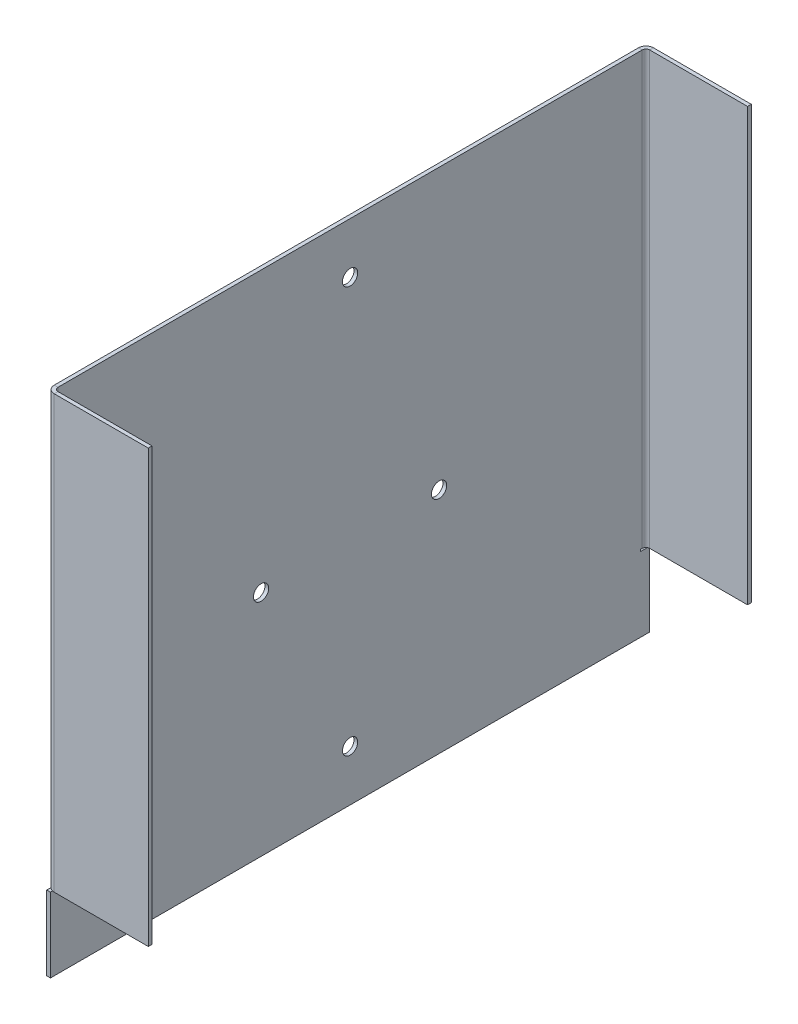
ISO-10303-21;
HEADER;
FILE_DESCRIPTION(('STEP AP214'),'2;1');
FILE_NAME('part.step','',(''),(''),'','','');
FILE_SCHEMA(('AUTOMOTIVE_DESIGN { 1 0 10303 214 1 1 1 1 }'));
ENDSEC;
DATA;
#1=APPLICATION_CONTEXT('core data for automotive mechanical design processes');
#2=APPLICATION_PROTOCOL_DEFINITION('international standard','automotive_design',2000,#1);
#3=PRODUCT_CONTEXT('',#1,'mechanical');
#4=PRODUCT('Part','Part','',(#3));
#5=PRODUCT_RELATED_PRODUCT_CATEGORY('part','',(#4));
#6=PRODUCT_DEFINITION_FORMATION('','',#4);
#7=PRODUCT_DEFINITION_CONTEXT('part definition',#1,'design');
#8=PRODUCT_DEFINITION('design','',#6,#7);
#9=PRODUCT_DEFINITION_SHAPE('','',#8);
#10=(LENGTH_UNIT() NAMED_UNIT(*) SI_UNIT(.MILLI.,.METRE.));
#11=(NAMED_UNIT(*) PLANE_ANGLE_UNIT() SI_UNIT($,.RADIAN.));
#12=(NAMED_UNIT(*) SI_UNIT($,.STERADIAN.) SOLID_ANGLE_UNIT());
#13=UNCERTAINTY_MEASURE_WITH_UNIT(LENGTH_MEASURE(1.E-05),#10,'distance_accuracy_value','');
#14=(GEOMETRIC_REPRESENTATION_CONTEXT(3) GLOBAL_UNCERTAINTY_ASSIGNED_CONTEXT((#13)) GLOBAL_UNIT_ASSIGNED_CONTEXT((#10,
#11,#12)) REPRESENTATION_CONTEXT('',''));
#15=CARTESIAN_POINT('',(0.,0.,0.));
#16=DIRECTION('',(0.,0.,1.));
#17=DIRECTION('',(1.,0.,0.));
#18=AXIS2_PLACEMENT_3D('',#15,#16,#17);
#19=CARTESIAN_POINT('',(-0.7366,0.,0.));
#20=DIRECTION('',(1.,0.,0.));
#21=DIRECTION('',(0.,0.,-1.));
#22=AXIS2_PLACEMENT_3D('',#19,#20,#21);
#23=PLANE('',#22);
#24=CARTESIAN_POINT('',(-0.7366,-5.00000000000002,17.5268));
#25=DIRECTION('',(-1.,0.,0.));
#26=DIRECTION('',(0.,0.,1.));
#27=AXIS2_PLACEMENT_3D('',#24,#25,#26);
#28=CIRCLE('',#27,1.5);
#29=CARTESIAN_POINT('',(-0.7366,-5.00000000000002,19.0268));
#30=VERTEX_POINT('',#29);
#31=EDGE_CURVE('E419',#30,#30,#28,.T.);
#32=ORIENTED_EDGE('',*,*,#31,.F.);
#33=EDGE_LOOP('',(#32));
#34=FACE_BOUND('',#33,.T.);
#35=CARTESIAN_POINT('',(-0.7366,-5.00000000000002,-17.5268));
#36=DIRECTION('',(-1.,0.,0.));
#37=DIRECTION('',(0.,0.,1.));
#38=AXIS2_PLACEMENT_3D('',#35,#36,#37);
#39=CIRCLE('',#38,1.5);
#40=CARTESIAN_POINT('',(-0.7366,-5.00000000000002,-16.0268));
#41=VERTEX_POINT('',#40);
#42=EDGE_CURVE('E409',#41,#41,#39,.T.);
#43=ORIENTED_EDGE('',*,*,#42,.F.);
#44=EDGE_LOOP('',(#43));
#45=FACE_BOUND('',#44,.T.);
#46=CARTESIAN_POINT('',(-0.7366,-40.,0.));
#47=DIRECTION('',(-1.,0.,0.));
#48=DIRECTION('',(0.,0.,1.));
#49=AXIS2_PLACEMENT_3D('',#46,#47,#48);
#50=CIRCLE('',#49,1.5);
#51=CARTESIAN_POINT('',(-0.7366,-40.,1.49999999999999));
#52=VERTEX_POINT('',#51);
#53=EDGE_CURVE('E406',#52,#52,#50,.T.);
#54=ORIENTED_EDGE('',*,*,#53,.F.);
#55=EDGE_LOOP('',(#54));
#56=FACE_BOUND('',#55,.T.);
#57=CARTESIAN_POINT('',(-0.7366,40.,0.));
#58=DIRECTION('',(-1.,0.,0.));
#59=DIRECTION('',(0.,0.,1.));
#60=AXIS2_PLACEMENT_3D('',#57,#58,#59);
#61=CIRCLE('',#60,1.5);
#62=CARTESIAN_POINT('',(-0.7366,40.,1.49999999999999));
#63=VERTEX_POINT('',#62);
#64=EDGE_CURVE('E403',#63,#63,#61,.T.);
#65=ORIENTED_EDGE('',*,*,#64,.F.);
#66=EDGE_LOOP('',(#65));
#67=FACE_BOUND('',#66,.T.);
#68=DIRECTION('',(0.,1.,0.));
#69=VECTOR('',#68,1.);
#70=CARTESIAN_POINT('',(-0.73659999999999,50.,-57.5268));
#71=LINE('',#70,#69);
#72=CARTESIAN_POINT('',(-0.73659999999999,50.,-57.5268));
#73=VERTEX_POINT('',#72);
#74=CARTESIAN_POINT('',(-0.7366,-35.,-57.5268));
#75=VERTEX_POINT('',#74);
#76=EDGE_CURVE('E259',#73,#75,#71,.F.);
#77=ORIENTED_EDGE('',*,*,#76,.T.);
#78=DIRECTION('',(0.,0.,-1.));
#79=VECTOR('',#78,1.);
#80=CARTESIAN_POINT('',(-0.7366,-35.,0.));
#81=LINE('',#80,#79);
#82=CARTESIAN_POINT('',(-0.7366,-35.,-57.1585));
#83=VERTEX_POINT('',#82);
#84=EDGE_CURVE('E302',#83,#75,#81,.T.);
#85=ORIENTED_EDGE('',*,*,#84,.F.);
#86=DIRECTION('',(0.,1.,0.));
#87=VECTOR('',#86,1.);
#88=CARTESIAN_POINT('',(-0.7366,0.,-57.1585));
#89=LINE('',#88,#87);
#90=CARTESIAN_POINT('',(-0.7366,-35.3683,-57.1585));
#91=VERTEX_POINT('',#90);
#92=EDGE_CURVE('E300',#91,#83,#89,.T.);
#93=ORIENTED_EDGE('',*,*,#92,.F.);
#94=DIRECTION('',(0.,0.,1.));
#95=VECTOR('',#94,1.);
#96=CARTESIAN_POINT('',(-0.7366,-35.3683,0.));
#97=LINE('',#96,#95);
#98=CARTESIAN_POINT('',(-0.7366,-35.3683,-59.));
#99=VERTEX_POINT('',#98);
#100=EDGE_CURVE('E287',#99,#91,#97,.T.);
#101=ORIENTED_EDGE('',*,*,#100,.F.);
#102=DIRECTION('',(0.,1.,0.));
#103=VECTOR('',#102,1.);
#104=CARTESIAN_POINT('',(-0.7366,-50.,-59.));
#105=LINE('',#104,#103);
#106=CARTESIAN_POINT('',(-0.7366,-50.,-59.));
#107=VERTEX_POINT('',#106);
#108=EDGE_CURVE('E386',#107,#99,#105,.T.);
#109=ORIENTED_EDGE('',*,*,#108,.F.);
#110=DIRECTION('',(0.,0.,-1.));
#111=VECTOR('',#110,1.);
#112=CARTESIAN_POINT('',(-0.7366,-50.,-59.));
#113=LINE('',#112,#111);
#114=CARTESIAN_POINT('',(-0.7366,-50.,59.));
#115=VERTEX_POINT('',#114);
#116=EDGE_CURVE('E382',#115,#107,#113,.T.);
#117=ORIENTED_EDGE('',*,*,#116,.F.);
#118=DIRECTION('',(0.,-1.,0.));
#119=VECTOR('',#118,1.);
#120=CARTESIAN_POINT('',(-0.7366,-50.,59.));
#121=LINE('',#120,#119);
#122=CARTESIAN_POINT('',(-0.7366,-35.3683,59.));
#123=VERTEX_POINT('',#122);
#124=EDGE_CURVE('E380',#123,#115,#121,.T.);
#125=ORIENTED_EDGE('',*,*,#124,.F.);
#126=DIRECTION('',(0.,0.,1.));
#127=VECTOR('',#126,1.);
#128=CARTESIAN_POINT('',(-0.7366,-35.3683,0.));
#129=LINE('',#128,#127);
#130=CARTESIAN_POINT('',(-0.7366,-35.3683,57.1585));
#131=VERTEX_POINT('',#130);
#132=EDGE_CURVE('E377',#131,#123,#129,.T.);
#133=ORIENTED_EDGE('',*,*,#132,.F.);
#134=DIRECTION('',(0.,-1.,0.));
#135=VECTOR('',#134,1.);
#136=CARTESIAN_POINT('',(-0.7366,0.,57.1585));
#137=LINE('',#136,#135);
#138=CARTESIAN_POINT('',(-0.7366,-35.,57.1585));
#139=VERTEX_POINT('',#138);
#140=EDGE_CURVE('E375',#139,#131,#137,.T.);
#141=ORIENTED_EDGE('',*,*,#140,.F.);
#142=DIRECTION('',(0.,0.,-1.));
#143=VECTOR('',#142,1.);
#144=CARTESIAN_POINT('',(-0.7366,-35.,0.));
#145=LINE('',#144,#143);
#146=CARTESIAN_POINT('',(-0.7366,-35.,57.5268));
#147=VERTEX_POINT('',#146);
#148=EDGE_CURVE('E361',#147,#139,#145,.T.);
#149=ORIENTED_EDGE('',*,*,#148,.F.);
#150=DIRECTION('',(0.,-1.,0.));
#151=VECTOR('',#150,1.);
#152=CARTESIAN_POINT('',(-0.7366,-35.,57.5268));
#153=LINE('',#152,#151);
#154=CARTESIAN_POINT('',(-0.7366,50.,57.5268));
#155=VERTEX_POINT('',#154);
#156=EDGE_CURVE('E335',#147,#155,#153,.F.);
#157=ORIENTED_EDGE('',*,*,#156,.T.);
#158=DIRECTION('',(0.,0.,1.));
#159=VECTOR('',#158,1.);
#160=CARTESIAN_POINT('',(-0.7366,50.,-59.));
#161=LINE('',#160,#159);
#162=EDGE_CURVE('E389',#73,#155,#161,.T.);
#163=ORIENTED_EDGE('',*,*,#162,.F.);
#164=EDGE_LOOP('',(#77,#85,#93,#101,#109,#117,#125,#133,#141,#149,#157,#163));
#165=FACE_BOUND('',#164,.T.);
#166=ADVANCED_FACE('F78',(#34,#45,#56,#67,#165),#23,.F.);
#167=CARTESIAN_POINT('',(0.,0.,0.));
#168=DIRECTION('',(1.,0.,0.));
#169=DIRECTION('',(0.,0.,-1.));
#170=AXIS2_PLACEMENT_3D('',#167,#168,#169);
#171=PLANE('',#170);
#172=CARTESIAN_POINT('',(0.,-5.00000000000002,17.5268));
#173=DIRECTION('',(1.,0.,0.));
#174=DIRECTION('',(0.,0.,-1.));
#175=AXIS2_PLACEMENT_3D('',#172,#173,#174);
#176=CIRCLE('',#175,1.5);
#177=CARTESIAN_POINT('',(0.,-5.00000000000002,16.0268));
#178=VERTEX_POINT('',#177);
#179=EDGE_CURVE('E82',#178,#178,#176,.T.);
#180=ORIENTED_EDGE('',*,*,#179,.F.);
#181=EDGE_LOOP('',(#180));
#182=FACE_BOUND('',#181,.T.);
#183=CARTESIAN_POINT('',(0.,-5.00000000000002,-17.5268));
#184=DIRECTION('',(1.,0.,0.));
#185=DIRECTION('',(0.,0.,-1.));
#186=AXIS2_PLACEMENT_3D('',#183,#184,#185);
#187=CIRCLE('',#186,1.5);
#188=CARTESIAN_POINT('',(0.,-5.00000000000002,-19.0268));
#189=VERTEX_POINT('',#188);
#190=EDGE_CURVE('E407',#189,#189,#187,.T.);
#191=ORIENTED_EDGE('',*,*,#190,.F.);
#192=EDGE_LOOP('',(#191));
#193=FACE_BOUND('',#192,.T.);
#194=CARTESIAN_POINT('',(0.,-40.,0.));
#195=DIRECTION('',(1.,0.,0.));
#196=DIRECTION('',(0.,0.,-1.));
#197=AXIS2_PLACEMENT_3D('',#194,#195,#196);
#198=CIRCLE('',#197,1.5);
#199=CARTESIAN_POINT('',(0.,-40.,-1.50000000000001));
#200=VERTEX_POINT('',#199);
#201=EDGE_CURVE('E404',#200,#200,#198,.T.);
#202=ORIENTED_EDGE('',*,*,#201,.F.);
#203=EDGE_LOOP('',(#202));
#204=FACE_BOUND('',#203,.T.);
#205=CARTESIAN_POINT('',(0.,40.,0.));
#206=DIRECTION('',(1.,0.,0.));
#207=DIRECTION('',(0.,0.,-1.));
#208=AXIS2_PLACEMENT_3D('',#205,#206,#207);
#209=CIRCLE('',#208,1.5);
#210=CARTESIAN_POINT('',(0.,40.,-1.50000000000001));
#211=VERTEX_POINT('',#210);
#212=EDGE_CURVE('E258',#211,#211,#209,.T.);
#213=ORIENTED_EDGE('',*,*,#212,.F.);
#214=EDGE_LOOP('',(#213));
#215=FACE_BOUND('',#214,.T.);
#216=DIRECTION('',(0.,0.,1.));
#217=VECTOR('',#216,1.);
#218=CARTESIAN_POINT('',(0.,-35.,-57.5268));
#219=LINE('',#218,#217);
#220=CARTESIAN_POINT('',(0.,-35.,-57.5268));
#221=VERTEX_POINT('',#220);
#222=CARTESIAN_POINT('',(0.,-35.,-57.1585));
#223=VERTEX_POINT('',#222);
#224=EDGE_CURVE('E284',#221,#223,#219,.T.);
#225=ORIENTED_EDGE('',*,*,#224,.F.);
#226=DIRECTION('',(0.,1.,0.));
#227=VECTOR('',#226,1.);
#228=CARTESIAN_POINT('',(0.,50.,-57.5268));
#229=LINE('',#228,#227);
#230=CARTESIAN_POINT('',(0.,50.,-57.5268));
#231=VERTEX_POINT('',#230);
#232=EDGE_CURVE('E272',#231,#221,#229,.F.);
#233=ORIENTED_EDGE('',*,*,#232,.F.);
#234=DIRECTION('',(0.,0.,1.));
#235=VECTOR('',#234,1.);
#236=CARTESIAN_POINT('',(0.,50.,-59.));
#237=LINE('',#236,#235);
#238=CARTESIAN_POINT('',(0.,50.,57.5268));
#239=VERTEX_POINT('',#238);
#240=EDGE_CURVE('E383',#231,#239,#237,.T.);
#241=ORIENTED_EDGE('',*,*,#240,.T.);
#242=DIRECTION('',(0.,-1.,0.));
#243=VECTOR('',#242,1.);
#244=CARTESIAN_POINT('',(0.,-35.,57.5268));
#245=LINE('',#244,#243);
#246=CARTESIAN_POINT('',(0.,-35.,57.5268));
#247=VERTEX_POINT('',#246);
#248=EDGE_CURVE('E348',#247,#239,#245,.F.);
#249=ORIENTED_EDGE('',*,*,#248,.F.);
#250=DIRECTION('',(0.,0.,1.));
#251=VECTOR('',#250,1.);
#252=CARTESIAN_POINT('',(0.,-35.,57.1585));
#253=LINE('',#252,#251);
#254=CARTESIAN_POINT('',(0.,-35.,57.1585));
#255=VERTEX_POINT('',#254);
#256=EDGE_CURVE('E103',#255,#247,#253,.T.);
#257=ORIENTED_EDGE('',*,*,#256,.F.);
#258=DIRECTION('',(0.,1.,0.));
#259=VECTOR('',#258,1.);
#260=CARTESIAN_POINT('',(0.,-35.3683,57.1585));
#261=LINE('',#260,#259);
#262=CARTESIAN_POINT('',(0.,-35.3683,57.1585));
#263=VERTEX_POINT('',#262);
#264=EDGE_CURVE('E363',#263,#255,#261,.T.);
#265=ORIENTED_EDGE('',*,*,#264,.F.);
#266=DIRECTION('',(0.,0.,-1.));
#267=VECTOR('',#266,1.);
#268=CARTESIAN_POINT('',(0.,-35.3683,59.));
#269=LINE('',#268,#267);
#270=CARTESIAN_POINT('',(0.,-35.3683,59.));
#271=VERTEX_POINT('',#270);
#272=EDGE_CURVE('E358',#271,#263,#269,.T.);
#273=ORIENTED_EDGE('',*,*,#272,.F.);
#274=DIRECTION('',(0.,-1.,0.));
#275=VECTOR('',#274,1.);
#276=CARTESIAN_POINT('',(0.,-50.,59.));
#277=LINE('',#276,#275);
#278=CARTESIAN_POINT('',(0.,-50.,59.));
#279=VERTEX_POINT('',#278);
#280=EDGE_CURVE('E379',#271,#279,#277,.T.);
#281=ORIENTED_EDGE('',*,*,#280,.T.);
#282=DIRECTION('',(0.,0.,-1.));
#283=VECTOR('',#282,1.);
#284=CARTESIAN_POINT('',(0.,-50.,-59.));
#285=LINE('',#284,#283);
#286=CARTESIAN_POINT('',(0.,-50.,-59.));
#287=VERTEX_POINT('',#286);
#288=EDGE_CURVE('E392',#279,#287,#285,.T.);
#289=ORIENTED_EDGE('',*,*,#288,.T.);
#290=DIRECTION('',(0.,1.,0.));
#291=VECTOR('',#290,1.);
#292=CARTESIAN_POINT('',(0.,-50.,-59.));
#293=LINE('',#292,#291);
#294=CARTESIAN_POINT('',(0.,-35.3683,-59.));
#295=VERTEX_POINT('',#294);
#296=EDGE_CURVE('E395',#287,#295,#293,.T.);
#297=ORIENTED_EDGE('',*,*,#296,.T.);
#298=DIRECTION('',(0.,0.,-1.));
#299=VECTOR('',#298,1.);
#300=CARTESIAN_POINT('',(0.,-35.3683,-57.1585));
#301=LINE('',#300,#299);
#302=CARTESIAN_POINT('',(0.,-35.3683,-57.1585));
#303=VERTEX_POINT('',#302);
#304=EDGE_CURVE('E95',#303,#295,#301,.T.);
#305=ORIENTED_EDGE('',*,*,#304,.F.);
#306=DIRECTION('',(0.,-1.,0.));
#307=VECTOR('',#306,1.);
#308=CARTESIAN_POINT('',(0.,-35.,-57.1585));
#309=LINE('',#308,#307);
#310=EDGE_CURVE('E288',#223,#303,#309,.T.);
#311=ORIENTED_EDGE('',*,*,#310,.F.);
#312=EDGE_LOOP('',(#225,#233,#241,#249,#257,#265,#273,#281,#289,#297,#305,#311));
#313=FACE_BOUND('',#312,.T.);
#314=ADVANCED_FACE('F448',(#182,#193,#204,#215,#313),#171,.T.);
#315=CARTESIAN_POINT('',(-0.7366,50.,-59.));
#316=DIRECTION('',(0.,1.,0.));
#317=DIRECTION('',(0.,0.,1.));
#318=AXIS2_PLACEMENT_3D('',#315,#316,#317);
#319=PLANE('',#318);
#320=ORIENTED_EDGE('',*,*,#240,.F.);
#321=DIRECTION('',(-1.,0.,0.));
#322=VECTOR('',#321,1.);
#323=CARTESIAN_POINT('',(0.,50.,-57.5268));
#324=LINE('',#323,#322);
#325=EDGE_CURVE('E266',#231,#73,#324,.T.);
#326=ORIENTED_EDGE('',*,*,#325,.T.);
#327=ORIENTED_EDGE('',*,*,#162,.T.);
#328=DIRECTION('',(-1.,0.,0.));
#329=VECTOR('',#328,1.);
#330=CARTESIAN_POINT('',(0.,50.,57.5268));
#331=LINE('',#330,#329);
#332=EDGE_CURVE('E353',#239,#155,#331,.T.);
#333=ORIENTED_EDGE('',*,*,#332,.F.);
#334=EDGE_LOOP('',(#320,#326,#327,#333));
#335=FACE_BOUND('',#334,.T.);
#336=ADVANCED_FACE('F454',(#335),#319,.T.);
#337=CARTESIAN_POINT('',(-0.7366,-50.,-59.));
#338=DIRECTION('',(0.,0.,-1.));
#339=DIRECTION('',(-1.,0.,0.));
#340=AXIS2_PLACEMENT_3D('',#337,#338,#339);
#341=PLANE('',#340);
#342=ORIENTED_EDGE('',*,*,#108,.T.);
#343=DIRECTION('',(-1.,0.,0.));
#344=VECTOR('',#343,1.);
#345=CARTESIAN_POINT('',(0.,-35.3683,-59.));
#346=LINE('',#345,#344);
#347=EDGE_CURVE('E293',#295,#99,#346,.T.);
#348=ORIENTED_EDGE('',*,*,#347,.F.);
#349=ORIENTED_EDGE('',*,*,#296,.F.);
#350=DIRECTION('',(1.,0.,0.));
#351=VECTOR('',#350,1.);
#352=CARTESIAN_POINT('',(-0.7366,-50.,-59.));
#353=LINE('',#352,#351);
#354=EDGE_CURVE('E13',#107,#287,#353,.T.);
#355=ORIENTED_EDGE('',*,*,#354,.F.);
#356=EDGE_LOOP('',(#342,#348,#349,#355));
#357=FACE_BOUND('',#356,.T.);
#358=ADVANCED_FACE('F465',(#357),#341,.T.);
#359=CARTESIAN_POINT('',(-0.7366,-50.,59.));
#360=DIRECTION('',(0.,0.,1.));
#361=DIRECTION('',(1.,0.,0.));
#362=AXIS2_PLACEMENT_3D('',#359,#360,#361);
#363=PLANE('',#362);
#364=ORIENTED_EDGE('',*,*,#280,.F.);
#365=DIRECTION('',(-1.,0.,0.));
#366=VECTOR('',#365,1.);
#367=CARTESIAN_POINT('',(0.,-35.3683,59.));
#368=LINE('',#367,#366);
#369=EDGE_CURVE('E362',#271,#123,#368,.T.);
#370=ORIENTED_EDGE('',*,*,#369,.T.);
#371=ORIENTED_EDGE('',*,*,#124,.T.);
#372=DIRECTION('',(1.,0.,0.));
#373=VECTOR('',#372,1.);
#374=CARTESIAN_POINT('',(-0.7366,-50.,59.));
#375=LINE('',#374,#373);
#376=EDGE_CURVE('E87',#115,#279,#375,.T.);
#377=ORIENTED_EDGE('',*,*,#376,.T.);
#378=EDGE_LOOP('',(#364,#370,#371,#377));
#379=FACE_BOUND('',#378,.T.);
#380=ADVANCED_FACE('F80',(#379),#363,.T.);
#381=CARTESIAN_POINT('',(-0.7366,-50.,-59.));
#382=DIRECTION('',(0.,-1.,0.));
#383=DIRECTION('',(0.,0.,-1.));
#384=AXIS2_PLACEMENT_3D('',#381,#382,#383);
#385=PLANE('',#384);
#386=ORIENTED_EDGE('',*,*,#288,.F.);
#387=ORIENTED_EDGE('',*,*,#376,.F.);
#388=ORIENTED_EDGE('',*,*,#116,.T.);
#389=ORIENTED_EDGE('',*,*,#354,.T.);
#390=EDGE_LOOP('',(#386,#387,#388,#389));
#391=FACE_BOUND('',#390,.T.);
#392=ADVANCED_FACE('F469',(#391),#385,.T.);
#393=CARTESIAN_POINT('',(0.,-35.3683,59.));
#394=DIRECTION('',(0.,1.,0.));
#395=DIRECTION('',(0.,0.,1.));
#396=AXIS2_PLACEMENT_3D('',#393,#394,#395);
#397=PLANE('',#396);
#398=DIRECTION('',(-1.,0.,0.));
#399=VECTOR('',#398,1.);
#400=CARTESIAN_POINT('',(0.,-35.3683,57.1585));
#401=LINE('',#400,#399);
#402=EDGE_CURVE('E366',#263,#131,#401,.T.);
#403=ORIENTED_EDGE('',*,*,#402,.T.);
#404=ORIENTED_EDGE('',*,*,#132,.T.);
#405=ORIENTED_EDGE('',*,*,#369,.F.);
#406=ORIENTED_EDGE('',*,*,#272,.T.);
#407=EDGE_LOOP('',(#403,#404,#405,#406));
#408=FACE_BOUND('',#407,.T.);
#409=ADVANCED_FACE('F460',(#408),#397,.T.);
#410=CARTESIAN_POINT('',(0.,-35.3683,57.1585));
#411=DIRECTION('',(0.,0.,1.));
#412=DIRECTION('',(1.,0.,0.));
#413=AXIS2_PLACEMENT_3D('',#410,#411,#412);
#414=PLANE('',#413);
#415=DIRECTION('',(-1.,0.,0.));
#416=VECTOR('',#415,1.);
#417=CARTESIAN_POINT('',(0.,-35.,57.1585));
#418=LINE('',#417,#416);
#419=EDGE_CURVE('E356',#255,#139,#418,.T.);
#420=ORIENTED_EDGE('',*,*,#419,.T.);
#421=ORIENTED_EDGE('',*,*,#140,.T.);
#422=ORIENTED_EDGE('',*,*,#402,.F.);
#423=ORIENTED_EDGE('',*,*,#264,.T.);
#424=EDGE_LOOP('',(#420,#421,#422,#423));
#425=FACE_BOUND('',#424,.T.);
#426=ADVANCED_FACE('F476',(#425),#414,.T.);
#427=CARTESIAN_POINT('',(0.,-35.,57.1585));
#428=DIRECTION('',(0.,-1.,0.));
#429=DIRECTION('',(0.,0.,-1.));
#430=AXIS2_PLACEMENT_3D('',#427,#428,#429);
#431=PLANE('',#430);
#432=DIRECTION('',(-1.,0.,0.));
#433=VECTOR('',#432,1.);
#434=CARTESIAN_POINT('',(0.,-35.,57.5268));
#435=LINE('',#434,#433);
#436=EDGE_CURVE('E342',#247,#147,#435,.T.);
#437=ORIENTED_EDGE('',*,*,#436,.T.);
#438=ORIENTED_EDGE('',*,*,#148,.T.);
#439=ORIENTED_EDGE('',*,*,#419,.F.);
#440=ORIENTED_EDGE('',*,*,#256,.T.);
#441=EDGE_LOOP('',(#437,#438,#439,#440));
#442=FACE_BOUND('',#441,.T.);
#443=ADVANCED_FACE('F558',(#442),#431,.T.);
#444=CARTESIAN_POINT('',(0.736599999999997,50.,57.5268));
#445=DIRECTION('',(0.,1.,0.));
#446=DIRECTION('',(0.,0.,1.));
#447=AXIS2_PLACEMENT_3D('',#444,#445,#446);
#448=PLANE('',#447);
#449=DIRECTION('',(0.,0.,-1.));
#450=VECTOR('',#449,1.);
#451=CARTESIAN_POINT('',(0.736599999999997,50.,59.));
#452=LINE('',#451,#450);
#453=CARTESIAN_POINT('',(0.736599999999994,50.,58.2634));
#454=VERTEX_POINT('',#453);
#455=CARTESIAN_POINT('',(0.736599999999992,50.,59.));
#456=VERTEX_POINT('',#455);
#457=EDGE_CURVE('E304',#454,#456,#452,.F.);
#458=ORIENTED_EDGE('',*,*,#457,.F.);
#459=CARTESIAN_POINT('',(0.736599999999997,50.,57.5268));
#460=DIRECTION('',(0.,-1.,0.));
#461=DIRECTION('',(0.,0.,-1.));
#462=AXIS2_PLACEMENT_3D('',#459,#460,#461);
#463=CIRCLE('',#462,0.736599999999997);
#464=EDGE_CURVE('E345',#239,#454,#463,.F.);
#465=ORIENTED_EDGE('',*,*,#464,.F.);
#466=ORIENTED_EDGE('',*,*,#332,.T.);
#467=CARTESIAN_POINT('',(0.736599999999997,50.,57.5268));
#468=DIRECTION('',(0.,-1.,0.));
#469=DIRECTION('',(0.,0.,-1.));
#470=AXIS2_PLACEMENT_3D('',#467,#468,#469);
#471=CIRCLE('',#470,1.4732);
#472=EDGE_CURVE('E338',#155,#456,#471,.F.);
#473=ORIENTED_EDGE('',*,*,#472,.T.);
#474=EDGE_LOOP('',(#458,#465,#466,#473));
#475=FACE_BOUND('',#474,.T.);
#476=ADVANCED_FACE('F555',(#475),#448,.T.);
#477=CARTESIAN_POINT('',(0.736599999999997,-35.,57.5268));
#478=DIRECTION('',(0.,1.,0.));
#479=DIRECTION('',(0.,0.,1.));
#480=AXIS2_PLACEMENT_3D('',#477,#478,#479);
#481=PLANE('',#480);
#482=CARTESIAN_POINT('',(0.736599999999997,-35.,57.5268));
#483=DIRECTION('',(0.,-1.,0.));
#484=DIRECTION('',(0.,0.,-1.));
#485=AXIS2_PLACEMENT_3D('',#482,#483,#484);
#486=CIRCLE('',#485,0.736599999999997);
#487=CARTESIAN_POINT('',(0.736599999999994,-35.,58.2634));
#488=VERTEX_POINT('',#487);
#489=EDGE_CURVE('E308',#488,#247,#486,.T.);
#490=ORIENTED_EDGE('',*,*,#489,.F.);
#491=DIRECTION('',(0.,0.,-1.));
#492=VECTOR('',#491,1.);
#493=CARTESIAN_POINT('',(0.736599999999997,-35.,58.2634));
#494=LINE('',#493,#492);
#495=CARTESIAN_POINT('',(0.736599999999997,-35.,59.));
#496=VERTEX_POINT('',#495);
#497=EDGE_CURVE('E328',#488,#496,#494,.F.);
#498=ORIENTED_EDGE('',*,*,#497,.T.);
#499=CARTESIAN_POINT('',(0.736599999999997,-35.,57.5268));
#500=DIRECTION('',(0.,-1.,0.));
#501=DIRECTION('',(0.,0.,-1.));
#502=AXIS2_PLACEMENT_3D('',#499,#500,#501);
#503=CIRCLE('',#502,1.4732);
#504=EDGE_CURVE('E339',#496,#147,#503,.T.);
#505=ORIENTED_EDGE('',*,*,#504,.T.);
#506=ORIENTED_EDGE('',*,*,#436,.F.);
#507=EDGE_LOOP('',(#490,#498,#505,#506));
#508=FACE_BOUND('',#507,.T.);
#509=ADVANCED_FACE('F550',(#508),#481,.F.);
#510=CARTESIAN_POINT('',(0.736599999999997,-35.,57.5268));
#511=DIRECTION('',(0.,-1.,0.));
#512=DIRECTION('',(0.,0.,1.));
#513=AXIS2_PLACEMENT_3D('',#510,#511,#512);
#514=CYLINDRICAL_SURFACE('',#513,1.4732);
#515=ORIENTED_EDGE('',*,*,#156,.F.);
#516=ORIENTED_EDGE('',*,*,#504,.F.);
#517=DIRECTION('',(0.,-1.,0.));
#518=VECTOR('',#517,1.);
#519=CARTESIAN_POINT('',(0.736599999999997,50.,59.));
#520=LINE('',#519,#518);
#521=EDGE_CURVE('E326',#496,#456,#520,.F.);
#522=ORIENTED_EDGE('',*,*,#521,.T.);
#523=ORIENTED_EDGE('',*,*,#472,.F.);
#524=EDGE_LOOP('',(#515,#516,#522,#523));
#525=FACE_BOUND('',#524,.T.);
#526=ADVANCED_FACE('F547',(#525),#514,.T.);
#527=CARTESIAN_POINT('',(0.736599999999997,-35.,57.5268));
#528=DIRECTION('',(0.,-1.,0.));
#529=DIRECTION('',(0.,0.,1.));
#530=AXIS2_PLACEMENT_3D('',#527,#528,#529);
#531=CYLINDRICAL_SURFACE('',#530,0.736599999999997);
#532=ORIENTED_EDGE('',*,*,#248,.T.);
#533=ORIENTED_EDGE('',*,*,#464,.T.);
#534=DIRECTION('',(0.,-1.,0.));
#535=VECTOR('',#534,1.);
#536=CARTESIAN_POINT('',(0.736599999999997,50.,58.2634));
#537=LINE('',#536,#535);
#538=EDGE_CURVE('E331',#454,#488,#537,.T.);
#539=ORIENTED_EDGE('',*,*,#538,.T.);
#540=ORIENTED_EDGE('',*,*,#489,.T.);
#541=EDGE_LOOP('',(#532,#533,#539,#540));
#542=FACE_BOUND('',#541,.T.);
#543=ADVANCED_FACE('F545',(#542),#531,.F.);
#544=CARTESIAN_POINT('',(0.,50.,59.));
#545=DIRECTION('',(0.,-1.,0.));
#546=DIRECTION('',(1.,0.,0.));
#547=AXIS2_PLACEMENT_3D('',#544,#545,#546);
#548=PLANE('',#547);
#549=ORIENTED_EDGE('',*,*,#457,.T.);
#550=DIRECTION('',(-1.,0.,0.));
#551=VECTOR('',#550,1.);
#552=CARTESIAN_POINT('',(-2.33107042120077E-13,50.,59.));
#553=LINE('',#552,#551);
#554=CARTESIAN_POINT('',(19.2634,50.,59.0000000000001));
#555=VERTEX_POINT('',#554);
#556=EDGE_CURVE('E316',#555,#456,#553,.T.);
#557=ORIENTED_EDGE('',*,*,#556,.F.);
#558=DIRECTION('',(0.,0.,-1.));
#559=VECTOR('',#558,1.);
#560=CARTESIAN_POINT('',(19.2634,50.,59.0000000000001));
#561=LINE('',#560,#559);
#562=CARTESIAN_POINT('',(19.2634,50.,58.2634000000001));
#563=VERTEX_POINT('',#562);
#564=EDGE_CURVE('E309',#555,#563,#561,.T.);
#565=ORIENTED_EDGE('',*,*,#564,.T.);
#566=DIRECTION('',(1.,0.,0.));
#567=VECTOR('',#566,1.);
#568=CARTESIAN_POINT('',(0.,50.,58.2634));
#569=LINE('',#568,#567);
#570=EDGE_CURVE('E323',#563,#454,#569,.F.);
#571=ORIENTED_EDGE('',*,*,#570,.T.);
#572=EDGE_LOOP('',(#549,#557,#565,#571));
#573=FACE_BOUND('',#572,.T.);
#574=ADVANCED_FACE('F541',(#573),#548,.F.);
#575=CARTESIAN_POINT('',(19.2634,-35.,59.0000000000001));
#576=DIRECTION('',(0.,1.,0.));
#577=DIRECTION('',(0.,0.,1.));
#578=AXIS2_PLACEMENT_3D('',#575,#576,#577);
#579=PLANE('',#578);
#580=ORIENTED_EDGE('',*,*,#497,.F.);
#581=DIRECTION('',(-1.,0.,0.));
#582=VECTOR('',#581,1.);
#583=CARTESIAN_POINT('',(19.2634,-35.,58.2634000000001));
#584=LINE('',#583,#582);
#585=CARTESIAN_POINT('',(19.2634,-35.,58.2634000000001));
#586=VERTEX_POINT('',#585);
#587=EDGE_CURVE('E321',#488,#586,#584,.F.);
#588=ORIENTED_EDGE('',*,*,#587,.T.);
#589=DIRECTION('',(0.,0.,-1.));
#590=VECTOR('',#589,1.);
#591=CARTESIAN_POINT('',(19.2634,-35.,59.0000000000001));
#592=LINE('',#591,#590);
#593=CARTESIAN_POINT('',(19.2634,-35.,59.0000000000001));
#594=VERTEX_POINT('',#593);
#595=EDGE_CURVE('E305',#594,#586,#592,.T.);
#596=ORIENTED_EDGE('',*,*,#595,.F.);
#597=DIRECTION('',(1.,0.,0.));
#598=VECTOR('',#597,1.);
#599=CARTESIAN_POINT('',(-2.15096478294617E-13,-35.,59.));
#600=LINE('',#599,#598);
#601=EDGE_CURVE('E314',#496,#594,#600,.T.);
#602=ORIENTED_EDGE('',*,*,#601,.F.);
#603=EDGE_LOOP('',(#580,#588,#596,#602));
#604=FACE_BOUND('',#603,.T.);
#605=ADVANCED_FACE('F531',(#604),#579,.F.);
#606=CARTESIAN_POINT('',(-2.15096478294617E-13,0.,59.));
#607=DIRECTION('',(0.,0.,-1.));
#608=DIRECTION('',(-1.,0.,0.));
#609=AXIS2_PLACEMENT_3D('',#606,#607,#608);
#610=PLANE('',#609);
#611=ORIENTED_EDGE('',*,*,#521,.F.);
#612=ORIENTED_EDGE('',*,*,#601,.T.);
#613=DIRECTION('',(0.,1.,0.));
#614=VECTOR('',#613,1.);
#615=CARTESIAN_POINT('',(19.2634,0.,59.0000000000001));
#616=LINE('',#615,#614);
#617=EDGE_CURVE('E312',#594,#555,#616,.T.);
#618=ORIENTED_EDGE('',*,*,#617,.T.);
#619=ORIENTED_EDGE('',*,*,#556,.T.);
#620=EDGE_LOOP('',(#611,#612,#618,#619));
#621=FACE_BOUND('',#620,.T.);
#622=ADVANCED_FACE('F527',(#621),#610,.F.);
#623=CARTESIAN_POINT('',(-2.12524653140425E-13,0.,58.2634));
#624=DIRECTION('',(0.,0.,-1.));
#625=DIRECTION('',(-1.,0.,0.));
#626=AXIS2_PLACEMENT_3D('',#623,#624,#625);
#627=PLANE('',#626);
#628=ORIENTED_EDGE('',*,*,#587,.F.);
#629=ORIENTED_EDGE('',*,*,#538,.F.);
#630=ORIENTED_EDGE('',*,*,#570,.F.);
#631=DIRECTION('',(0.,-1.,0.));
#632=VECTOR('',#631,1.);
#633=CARTESIAN_POINT('',(19.2634,50.,58.2634000000001));
#634=LINE('',#633,#632);
#635=EDGE_CURVE('E319',#586,#563,#634,.F.);
#636=ORIENTED_EDGE('',*,*,#635,.F.);
#637=EDGE_LOOP('',(#628,#629,#630,#636));
#638=FACE_BOUND('',#637,.T.);
#639=ADVANCED_FACE('F530',(#638),#627,.T.);
#640=CARTESIAN_POINT('',(19.2634,50.,59.0000000000001));
#641=DIRECTION('',(-1.,0.,0.));
#642=DIRECTION('',(0.,0.,1.));
#643=AXIS2_PLACEMENT_3D('',#640,#641,#642);
#644=PLANE('',#643);
#645=ORIENTED_EDGE('',*,*,#635,.T.);
#646=ORIENTED_EDGE('',*,*,#564,.F.);
#647=ORIENTED_EDGE('',*,*,#617,.F.);
#648=ORIENTED_EDGE('',*,*,#595,.T.);
#649=EDGE_LOOP('',(#645,#646,#647,#648));
#650=FACE_BOUND('',#649,.T.);
#651=ADVANCED_FACE('F526',(#650),#644,.F.);
#652=CARTESIAN_POINT('',(0.,-35.,-57.5268));
#653=DIRECTION('',(0.,-1.,0.));
#654=DIRECTION('',(0.,0.,-1.));
#655=AXIS2_PLACEMENT_3D('',#652,#653,#654);
#656=PLANE('',#655);
#657=DIRECTION('',(-1.,0.,0.));
#658=VECTOR('',#657,1.);
#659=CARTESIAN_POINT('',(0.,-35.,-57.1585));
#660=LINE('',#659,#658);
#661=EDGE_CURVE('E291',#223,#83,#660,.T.);
#662=ORIENTED_EDGE('',*,*,#661,.T.);
#663=ORIENTED_EDGE('',*,*,#84,.T.);
#664=DIRECTION('',(-1.,0.,0.));
#665=VECTOR('',#664,1.);
#666=CARTESIAN_POINT('',(0.,-35.,-57.5268));
#667=LINE('',#666,#665);
#668=EDGE_CURVE('E278',#221,#75,#667,.T.);
#669=ORIENTED_EDGE('',*,*,#668,.F.);
#670=ORIENTED_EDGE('',*,*,#224,.T.);
#671=EDGE_LOOP('',(#662,#663,#669,#670));
#672=FACE_BOUND('',#671,.T.);
#673=ADVANCED_FACE('F502',(#672),#656,.T.);
#674=CARTESIAN_POINT('',(0.,-35.,-57.1585));
#675=DIRECTION('',(0.,0.,-1.));
#676=DIRECTION('',(-1.,0.,0.));
#677=AXIS2_PLACEMENT_3D('',#674,#675,#676);
#678=PLANE('',#677);
#679=DIRECTION('',(-1.,0.,0.));
#680=VECTOR('',#679,1.);
#681=CARTESIAN_POINT('',(0.,-35.3683,-57.1585));
#682=LINE('',#681,#680);
#683=EDGE_CURVE('E281',#303,#91,#682,.T.);
#684=ORIENTED_EDGE('',*,*,#683,.T.);
#685=ORIENTED_EDGE('',*,*,#92,.T.);
#686=ORIENTED_EDGE('',*,*,#661,.F.);
#687=ORIENTED_EDGE('',*,*,#310,.T.);
#688=EDGE_LOOP('',(#684,#685,#686,#687));
#689=FACE_BOUND('',#688,.T.);
#690=ADVANCED_FACE('F497',(#689),#678,.T.);
#691=CARTESIAN_POINT('',(0.,-35.3683,-57.1585));
#692=DIRECTION('',(0.,1.,0.));
#693=DIRECTION('',(0.,0.,1.));
#694=AXIS2_PLACEMENT_3D('',#691,#692,#693);
#695=PLANE('',#694);
#696=ORIENTED_EDGE('',*,*,#347,.T.);
#697=ORIENTED_EDGE('',*,*,#100,.T.);
#698=ORIENTED_EDGE('',*,*,#683,.F.);
#699=ORIENTED_EDGE('',*,*,#304,.T.);
#700=EDGE_LOOP('',(#696,#697,#698,#699));
#701=FACE_BOUND('',#700,.T.);
#702=ADVANCED_FACE('F495',(#701),#695,.T.);
#703=CARTESIAN_POINT('',(0.736599999999994,-35.,-57.5268));
#704=DIRECTION('',(0.,-1.,0.));
#705=DIRECTION('',(1.,0.,0.));
#706=AXIS2_PLACEMENT_3D('',#703,#704,#705);
#707=PLANE('',#706);
#708=DIRECTION('',(0.,0.,1.));
#709=VECTOR('',#708,1.);
#710=CARTESIAN_POINT('',(0.736599999999997,-35.,-59.));
#711=LINE('',#710,#709);
#712=CARTESIAN_POINT('',(0.736599999999992,-35.,-58.2634));
#713=VERTEX_POINT('',#712);
#714=CARTESIAN_POINT('',(0.736599999999989,-35.,-59.));
#715=VERTEX_POINT('',#714);
#716=EDGE_CURVE('E241',#713,#715,#711,.F.);
#717=ORIENTED_EDGE('',*,*,#716,.F.);
#718=CARTESIAN_POINT('',(0.736599999999994,-35.,-57.5268));
#719=DIRECTION('',(0.,1.,0.));
#720=DIRECTION('',(-1.,0.,0.));
#721=AXIS2_PLACEMENT_3D('',#718,#719,#720);
#722=CIRCLE('',#721,0.736599999999997);
#723=EDGE_CURVE('E269',#221,#713,#722,.F.);
#724=ORIENTED_EDGE('',*,*,#723,.F.);
#725=ORIENTED_EDGE('',*,*,#668,.T.);
#726=CARTESIAN_POINT('',(0.736599999999994,-35.,-57.5268));
#727=DIRECTION('',(0.,1.,0.));
#728=DIRECTION('',(-1.,0.,0.));
#729=AXIS2_PLACEMENT_3D('',#726,#727,#728);
#730=CIRCLE('',#729,1.4732);
#731=EDGE_CURVE('E262',#75,#715,#730,.F.);
#732=ORIENTED_EDGE('',*,*,#731,.T.);
#733=EDGE_LOOP('',(#717,#724,#725,#732));
#734=FACE_BOUND('',#733,.T.);
#735=ADVANCED_FACE('F505',(#734),#707,.T.);
#736=CARTESIAN_POINT('',(0.736600000000007,50.,-57.5268));
#737=DIRECTION('',(0.,-1.,0.));
#738=DIRECTION('',(1.,0.,0.));
#739=AXIS2_PLACEMENT_3D('',#736,#737,#738);
#740=PLANE('',#739);
#741=CARTESIAN_POINT('',(0.736600000000007,50.,-57.5268));
#742=DIRECTION('',(0.,1.,0.));
#743=DIRECTION('',(-1.,0.,0.));
#744=AXIS2_PLACEMENT_3D('',#741,#742,#743);
#745=CIRCLE('',#744,0.736599999999997);
#746=CARTESIAN_POINT('',(0.736600000000004,50.,-58.2634));
#747=VERTEX_POINT('',#746);
#748=EDGE_CURVE('E275',#747,#231,#745,.T.);
#749=ORIENTED_EDGE('',*,*,#748,.F.);
#750=DIRECTION('',(0.,0.,1.));
#751=VECTOR('',#750,1.);
#752=CARTESIAN_POINT('',(0.736600000000004,50.,-58.2634));
#753=LINE('',#752,#751);
#754=CARTESIAN_POINT('',(0.736600000000004,50.,-59.));
#755=VERTEX_POINT('',#754);
#756=EDGE_CURVE('E252',#747,#755,#753,.F.);
#757=ORIENTED_EDGE('',*,*,#756,.T.);
#758=CARTESIAN_POINT('',(0.736600000000007,50.,-57.5268));
#759=DIRECTION('',(0.,1.,0.));
#760=DIRECTION('',(-1.,0.,0.));
#761=AXIS2_PLACEMENT_3D('',#758,#759,#760);
#762=CIRCLE('',#761,1.4732);
#763=EDGE_CURVE('E263',#755,#73,#762,.T.);
#764=ORIENTED_EDGE('',*,*,#763,.T.);
#765=ORIENTED_EDGE('',*,*,#325,.F.);
#766=EDGE_LOOP('',(#749,#757,#764,#765));
#767=FACE_BOUND('',#766,.T.);
#768=ADVANCED_FACE('F436',(#767),#740,.F.);
#769=CARTESIAN_POINT('',(0.736600000000007,50.,-57.5268));
#770=DIRECTION('',(0.,1.,0.));
#771=DIRECTION('',(0.,0.,-1.));
#772=AXIS2_PLACEMENT_3D('',#769,#770,#771);
#773=CYLINDRICAL_SURFACE('',#772,1.4732);
#774=ORIENTED_EDGE('',*,*,#76,.F.);
#775=ORIENTED_EDGE('',*,*,#763,.F.);
#776=DIRECTION('',(0.,1.,0.));
#777=VECTOR('',#776,1.);
#778=CARTESIAN_POINT('',(0.736599999999997,-35.,-59.));
#779=LINE('',#778,#777);
#780=EDGE_CURVE('E250',#755,#715,#779,.F.);
#781=ORIENTED_EDGE('',*,*,#780,.T.);
#782=ORIENTED_EDGE('',*,*,#731,.F.);
#783=EDGE_LOOP('',(#774,#775,#781,#782));
#784=FACE_BOUND('',#783,.T.);
#785=ADVANCED_FACE('F508',(#784),#773,.T.);
#786=CARTESIAN_POINT('',(0.736600000000007,50.,-57.5268));
#787=DIRECTION('',(0.,1.,0.));
#788=DIRECTION('',(0.,0.,-1.));
#789=AXIS2_PLACEMENT_3D('',#786,#787,#788);
#790=CYLINDRICAL_SURFACE('',#789,0.736599999999997);
#791=ORIENTED_EDGE('',*,*,#232,.T.);
#792=ORIENTED_EDGE('',*,*,#723,.T.);
#793=DIRECTION('',(0.,1.,0.));
#794=VECTOR('',#793,1.);
#795=CARTESIAN_POINT('',(0.736599999999997,-35.,-58.2634));
#796=LINE('',#795,#794);
#797=EDGE_CURVE('E255',#713,#747,#796,.T.);
#798=ORIENTED_EDGE('',*,*,#797,.T.);
#799=ORIENTED_EDGE('',*,*,#748,.T.);
#800=EDGE_LOOP('',(#791,#792,#798,#799));
#801=FACE_BOUND('',#800,.T.);
#802=ADVANCED_FACE('F431',(#801),#790,.F.);
#803=CARTESIAN_POINT('',(0.,-35.,-59.));
#804=DIRECTION('',(0.,1.,0.));
#805=DIRECTION('',(0.,0.,1.));
#806=AXIS2_PLACEMENT_3D('',#803,#804,#805);
#807=PLANE('',#806);
#808=ORIENTED_EDGE('',*,*,#716,.T.);
#809=DIRECTION('',(-1.,0.,0.));
#810=VECTOR('',#809,1.);
#811=CARTESIAN_POINT('',(-2.07269195319455E-13,-35.,-59.));
#812=LINE('',#811,#810);
#813=CARTESIAN_POINT('',(20.,-35.,-59.0000000000001));
#814=VERTEX_POINT('',#813);
#815=EDGE_CURVE('E222',#814,#715,#812,.T.);
#816=ORIENTED_EDGE('',*,*,#815,.F.);
#817=DIRECTION('',(0.,0.,1.));
#818=VECTOR('',#817,1.);
#819=CARTESIAN_POINT('',(20.,-35.,-59.0000000000001));
#820=LINE('',#819,#818);
#821=CARTESIAN_POINT('',(20.,-35.,-58.2634000000001));
#822=VERTEX_POINT('',#821);
#823=EDGE_CURVE('E228',#814,#822,#820,.T.);
#824=ORIENTED_EDGE('',*,*,#823,.T.);
#825=DIRECTION('',(1.,0.,0.));
#826=VECTOR('',#825,1.);
#827=CARTESIAN_POINT('',(0.,-35.,-58.2634));
#828=LINE('',#827,#826);
#829=EDGE_CURVE('E248',#822,#713,#828,.F.);
#830=ORIENTED_EDGE('',*,*,#829,.T.);
#831=EDGE_LOOP('',(#808,#816,#824,#830));
#832=FACE_BOUND('',#831,.T.);
#833=ADVANCED_FACE('F240',(#832),#807,.F.);
#834=CARTESIAN_POINT('',(20.,50.,-59.0000000000001));
#835=DIRECTION('',(0.,-1.,0.));
#836=DIRECTION('',(1.,0.,0.));
#837=AXIS2_PLACEMENT_3D('',#834,#835,#836);
#838=PLANE('',#837);
#839=ORIENTED_EDGE('',*,*,#756,.F.);
#840=DIRECTION('',(-1.,0.,0.));
#841=VECTOR('',#840,1.);
#842=CARTESIAN_POINT('',(20.,50.,-58.2634000000001));
#843=LINE('',#842,#841);
#844=CARTESIAN_POINT('',(20.,50.,-58.2634000000001));
#845=VERTEX_POINT('',#844);
#846=EDGE_CURVE('E244',#747,#845,#843,.F.);
#847=ORIENTED_EDGE('',*,*,#846,.T.);
#848=DIRECTION('',(0.,0.,1.));
#849=VECTOR('',#848,1.);
#850=CARTESIAN_POINT('',(20.,50.,-59.0000000000001));
#851=LINE('',#850,#849);
#852=CARTESIAN_POINT('',(20.,50.,-59.0000000000001));
#853=VERTEX_POINT('',#852);
#854=EDGE_CURVE('E237',#853,#845,#851,.T.);
#855=ORIENTED_EDGE('',*,*,#854,.F.);
#856=DIRECTION('',(1.,0.,0.));
#857=VECTOR('',#856,1.);
#858=CARTESIAN_POINT('',(-2.24616430079223E-13,50.,-59.));
#859=LINE('',#858,#857);
#860=EDGE_CURVE('E224',#755,#853,#859,.T.);
#861=ORIENTED_EDGE('',*,*,#860,.F.);
#862=EDGE_LOOP('',(#839,#847,#855,#861));
#863=FACE_BOUND('',#862,.T.);
#864=ADVANCED_FACE('F437',(#863),#838,.F.);
#865=CARTESIAN_POINT('',(-2.07269195319455E-13,0.,-59.));
#866=DIRECTION('',(0.,0.,1.));
#867=DIRECTION('',(1.,0.,0.));
#868=AXIS2_PLACEMENT_3D('',#865,#866,#867);
#869=PLANE('',#868);
#870=ORIENTED_EDGE('',*,*,#780,.F.);
#871=ORIENTED_EDGE('',*,*,#860,.T.);
#872=DIRECTION('',(0.,-1.,0.));
#873=VECTOR('',#872,1.);
#874=CARTESIAN_POINT('',(20.,0.,-59.0000000000001));
#875=LINE('',#874,#873);
#876=EDGE_CURVE('E217',#853,#814,#875,.T.);
#877=ORIENTED_EDGE('',*,*,#876,.T.);
#878=ORIENTED_EDGE('',*,*,#815,.T.);
#879=EDGE_LOOP('',(#870,#871,#877,#878));
#880=FACE_BOUND('',#879,.T.);
#881=ADVANCED_FACE('F220',(#880),#869,.F.);
#882=CARTESIAN_POINT('',(-2.04697370165263E-13,0.,-58.2634));
#883=DIRECTION('',(0.,0.,1.));
#884=DIRECTION('',(1.,0.,0.));
#885=AXIS2_PLACEMENT_3D('',#882,#883,#884);
#886=PLANE('',#885);
#887=ORIENTED_EDGE('',*,*,#846,.F.);
#888=ORIENTED_EDGE('',*,*,#797,.F.);
#889=ORIENTED_EDGE('',*,*,#829,.F.);
#890=DIRECTION('',(0.,1.,0.));
#891=VECTOR('',#890,1.);
#892=CARTESIAN_POINT('',(20.,-35.,-58.2634000000001));
#893=LINE('',#892,#891);
#894=EDGE_CURVE('E233',#845,#822,#893,.F.);
#895=ORIENTED_EDGE('',*,*,#894,.F.);
#896=EDGE_LOOP('',(#887,#888,#889,#895));
#897=FACE_BOUND('',#896,.T.);
#898=ADVANCED_FACE('F427',(#897),#886,.T.);
#899=CARTESIAN_POINT('',(20.,-35.,-59.0000000000001));
#900=DIRECTION('',(-1.,0.,0.));
#901=DIRECTION('',(0.,0.,1.));
#902=AXIS2_PLACEMENT_3D('',#899,#900,#901);
#903=PLANE('',#902);
#904=ORIENTED_EDGE('',*,*,#894,.T.);
#905=ORIENTED_EDGE('',*,*,#823,.F.);
#906=ORIENTED_EDGE('',*,*,#876,.F.);
#907=ORIENTED_EDGE('',*,*,#854,.T.);
#908=EDGE_LOOP('',(#904,#905,#906,#907));
#909=FACE_BOUND('',#908,.T.);
#910=ADVANCED_FACE('F231',(#909),#903,.F.);
#911=CARTESIAN_POINT('',(2.2634,40.,0.));
#912=DIRECTION('',(-1.,0.,0.));
#913=DIRECTION('',(0.,0.,1.));
#914=AXIS2_PLACEMENT_3D('',#911,#912,#913);
#915=CYLINDRICAL_SURFACE('',#914,1.5);
#916=ORIENTED_EDGE('',*,*,#212,.T.);
#917=EDGE_LOOP('',(#916));
#918=FACE_BOUND('',#917,.T.);
#919=ORIENTED_EDGE('',*,*,#64,.T.);
#920=EDGE_LOOP('',(#919));
#921=FACE_BOUND('',#920,.T.);
#922=ADVANCED_FACE('F699',(#918,#921),#915,.F.);
#923=CARTESIAN_POINT('',(2.2634,-40.,0.));
#924=DIRECTION('',(-1.,0.,0.));
#925=DIRECTION('',(0.,0.,1.));
#926=AXIS2_PLACEMENT_3D('',#923,#924,#925);
#927=CYLINDRICAL_SURFACE('',#926,1.5);
#928=ORIENTED_EDGE('',*,*,#201,.T.);
#929=EDGE_LOOP('',(#928));
#930=FACE_BOUND('',#929,.T.);
#931=ORIENTED_EDGE('',*,*,#53,.T.);
#932=EDGE_LOOP('',(#931));
#933=FACE_BOUND('',#932,.T.);
#934=ADVANCED_FACE('F708',(#930,#933),#927,.F.);
#935=CARTESIAN_POINT('',(2.2634,-5.00000000000002,-17.5268));
#936=DIRECTION('',(-1.,0.,0.));
#937=DIRECTION('',(0.,0.,1.));
#938=AXIS2_PLACEMENT_3D('',#935,#936,#937);
#939=CYLINDRICAL_SURFACE('',#938,1.5);
#940=ORIENTED_EDGE('',*,*,#190,.T.);
#941=EDGE_LOOP('',(#940));
#942=FACE_BOUND('',#941,.T.);
#943=ORIENTED_EDGE('',*,*,#42,.T.);
#944=EDGE_LOOP('',(#943));
#945=FACE_BOUND('',#944,.T.);
#946=ADVANCED_FACE('F718',(#942,#945),#939,.F.);
#947=CARTESIAN_POINT('',(2.2634,-5.00000000000002,17.5268));
#948=DIRECTION('',(-1.,0.,0.));
#949=DIRECTION('',(0.,0.,1.));
#950=AXIS2_PLACEMENT_3D('',#947,#948,#949);
#951=CYLINDRICAL_SURFACE('',#950,1.5);
#952=ORIENTED_EDGE('',*,*,#179,.T.);
#953=EDGE_LOOP('',(#952));
#954=FACE_BOUND('',#953,.T.);
#955=ORIENTED_EDGE('',*,*,#31,.T.);
#956=EDGE_LOOP('',(#955));
#957=FACE_BOUND('',#956,.T.);
#958=ADVANCED_FACE('F727',(#954,#957),#951,.F.);
#959=CLOSED_SHELL('',(#166,#314,#336,#358,#380,#392,#409,#426,#443,#476,#509,#526,#543,#574,
#605,#622,#639,#651,#673,#690,#702,#735,#768,#785,#802,#833,#864,#881,#898,#910,#922,#934,#946,#958));
#960=MANIFOLD_SOLID_BREP('B2',#959);
#961=ADVANCED_BREP_SHAPE_REPRESENTATION('',(#18,#960),#14);
#962=SHAPE_DEFINITION_REPRESENTATION(#9,#961);
ENDSEC;
END-ISO-10303-21;
